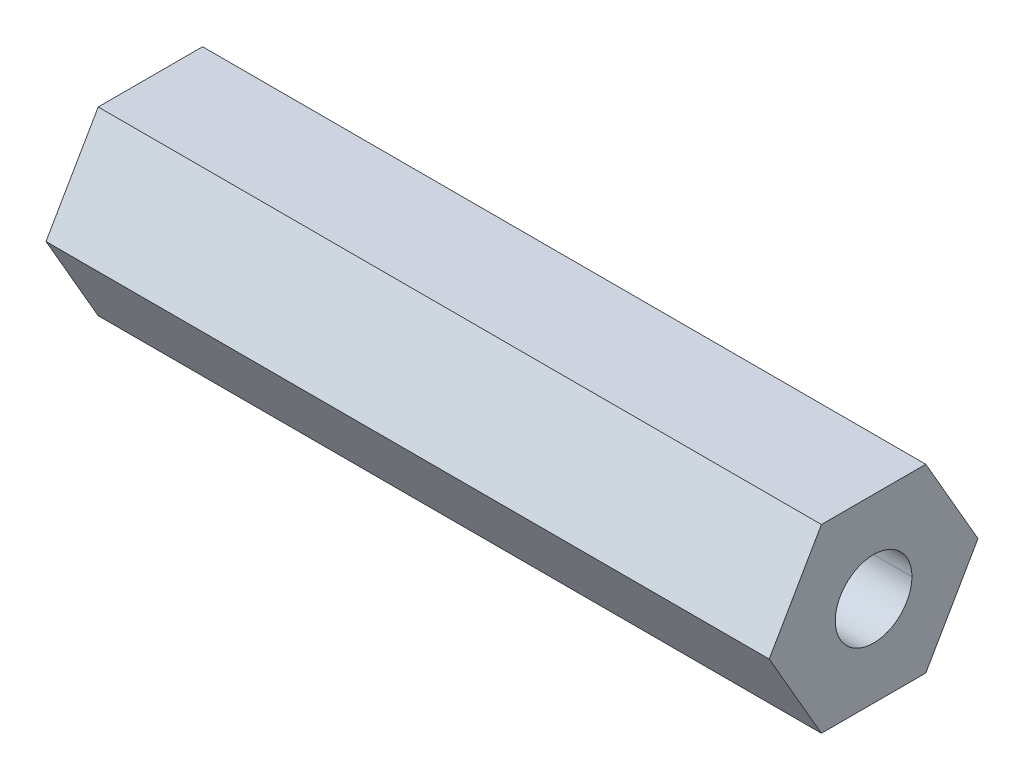
ISO-10303-21;
HEADER;
FILE_DESCRIPTION(('STEP AP214'),'2;1');
FILE_NAME('part.step','',(''),(''),'','','');
FILE_SCHEMA(('AUTOMOTIVE_DESIGN { 1 0 10303 214 1 1 1 1 }'));
ENDSEC;
DATA;
#1=APPLICATION_CONTEXT('core data for automotive mechanical design processes');
#2=APPLICATION_PROTOCOL_DEFINITION('international standard','automotive_design',2000,#1);
#3=PRODUCT_CONTEXT('',#1,'mechanical');
#4=PRODUCT('Part','Part','',(#3));
#5=PRODUCT_RELATED_PRODUCT_CATEGORY('part','',(#4));
#6=PRODUCT_DEFINITION_FORMATION('','',#4);
#7=PRODUCT_DEFINITION_CONTEXT('part definition',#1,'design');
#8=PRODUCT_DEFINITION('design','',#6,#7);
#9=PRODUCT_DEFINITION_SHAPE('','',#8);
#10=(LENGTH_UNIT() NAMED_UNIT(*) SI_UNIT(.MILLI.,.METRE.));
#11=(NAMED_UNIT(*) PLANE_ANGLE_UNIT() SI_UNIT($,.RADIAN.));
#12=(NAMED_UNIT(*) SI_UNIT($,.STERADIAN.) SOLID_ANGLE_UNIT());
#13=UNCERTAINTY_MEASURE_WITH_UNIT(LENGTH_MEASURE(1.E-05),#10,'distance_accuracy_value','');
#14=(GEOMETRIC_REPRESENTATION_CONTEXT(3) GLOBAL_UNCERTAINTY_ASSIGNED_CONTEXT((#13)) GLOBAL_UNIT_ASSIGNED_CONTEXT((#10,
#11,#12)) REPRESENTATION_CONTEXT('',''));
#15=CARTESIAN_POINT('',(0.,0.,0.));
#16=DIRECTION('',(0.,0.,1.));
#17=DIRECTION('',(1.,0.,0.));
#18=AXIS2_PLACEMENT_3D('',#15,#16,#17);
#19=CARTESIAN_POINT('',(38.1,0.,0.));
#20=DIRECTION('',(1.,0.,0.));
#21=DIRECTION('',(0.,0.,-1.));
#22=AXIS2_PLACEMENT_3D('',#19,#20,#21);
#23=CYLINDRICAL_SURFACE('',#22,2.0193);
#24=DIRECTION('',(1.,0.,0.));
#25=VECTOR('',#24,1.);
#26=CARTESIAN_POINT('',(38.1,0.,2.0193));
#27=LINE('',#26,#25);
#28=CARTESIAN_POINT('',(6.35,0.,2.0193));
#29=VERTEX_POINT('',#28);
#30=CARTESIAN_POINT('',(38.1,0.,2.0193));
#31=VERTEX_POINT('',#30);
#32=EDGE_CURVE('E160',#29,#31,#27,.T.);
#33=ORIENTED_EDGE('',*,*,#32,.F.);
#34=CARTESIAN_POINT('',(6.35,0.,0.));
#35=DIRECTION('',(1.,0.,0.));
#36=DIRECTION('',(0.,0.,-1.));
#37=AXIS2_PLACEMENT_3D('',#34,#35,#36);
#38=CIRCLE('',#37,2.0193);
#39=CARTESIAN_POINT('',(6.35,0.,-2.0193));
#40=VERTEX_POINT('',#39);
#41=EDGE_CURVE('E46',#40,#29,#38,.T.);
#42=ORIENTED_EDGE('',*,*,#41,.F.);
#43=DIRECTION('',(1.,0.,0.));
#44=VECTOR('',#43,1.);
#45=CARTESIAN_POINT('',(38.1,0.,-2.0193));
#46=LINE('',#45,#44);
#47=CARTESIAN_POINT('',(38.1,0.,-2.0193));
#48=VERTEX_POINT('',#47);
#49=EDGE_CURVE('E159',#40,#48,#46,.T.);
#50=ORIENTED_EDGE('',*,*,#49,.T.);
#51=CARTESIAN_POINT('',(38.1,0.,0.));
#52=DIRECTION('',(1.,0.,0.));
#53=DIRECTION('',(0.,0.,-1.));
#54=AXIS2_PLACEMENT_3D('',#51,#52,#53);
#55=CIRCLE('',#54,2.0193);
#56=EDGE_CURVE('E94',#48,#31,#55,.T.);
#57=ORIENTED_EDGE('',*,*,#56,.T.);
#58=EDGE_LOOP('',(#33,#42,#50,#57));
#59=FACE_BOUND('',#58,.T.);
#60=ADVANCED_FACE('F38',(#59),#23,.F.);
#61=CARTESIAN_POINT('',(6.35,0.,0.));
#62=DIRECTION('',(1.,0.,0.));
#63=DIRECTION('',(0.,0.,-1.));
#64=AXIS2_PLACEMENT_3D('',#61,#62,#63);
#65=CONICAL_SURFACE('',#64,2.0193,1.02974425867665);
#66=DIRECTION('',(0.515038074910058,0.,0.85716730070211));
#67=VECTOR('',#66,1.);
#68=CARTESIAN_POINT('',(6.35,0.,2.0193));
#69=LINE('',#68,#67);
#70=CARTESIAN_POINT('',(5.13668215199765,0.,0.));
#71=VERTEX_POINT('',#70);
#72=EDGE_CURVE('E133',#71,#29,#69,.T.);
#73=ORIENTED_EDGE('',*,*,#72,.F.);
#74=DIRECTION('',(0.515038074910058,0.,-0.85716730070211));
#75=VECTOR('',#74,1.);
#76=CARTESIAN_POINT('',(6.35,0.,-2.0193));
#77=LINE('',#76,#75);
#78=EDGE_CURVE('E140',#71,#40,#77,.T.);
#79=ORIENTED_EDGE('',*,*,#78,.T.);
#80=ORIENTED_EDGE('',*,*,#41,.T.);
#81=EDGE_LOOP('',(#73,#79,#80));
#82=FACE_BOUND('',#81,.T.);
#83=ADVANCED_FACE('F291',(#82),#65,.F.);
#84=CARTESIAN_POINT('',(38.1,0.,0.));
#85=DIRECTION('',(1.,0.,0.));
#86=DIRECTION('',(0.,1.,0.));
#87=AXIS2_PLACEMENT_3D('',#84,#85,#86);
#88=PLANE('',#87);
#89=ORIENTED_EDGE('',*,*,#56,.F.);
#90=CARTESIAN_POINT('',(38.1,0.,0.));
#91=DIRECTION('',(1.,0.,0.));
#92=DIRECTION('',(0.,0.,-1.));
#93=AXIS2_PLACEMENT_3D('',#90,#91,#92);
#94=CIRCLE('',#93,2.0193);
#95=EDGE_CURVE('E164',#31,#48,#94,.T.);
#96=ORIENTED_EDGE('',*,*,#95,.F.);
#97=EDGE_LOOP('',(#89,#96));
#98=FACE_BOUND('',#97,.T.);
#99=DIRECTION('',(0.,0.866025403784442,-0.5));
#100=VECTOR('',#99,1.);
#101=CARTESIAN_POINT('',(38.1,-4.7625,-2.74963065701564));
#102=LINE('',#101,#100);
#103=CARTESIAN_POINT('',(38.1,-4.7625,-2.74963065701564));
#104=VERTEX_POINT('',#103);
#105=CARTESIAN_POINT('',(38.1,0.,-5.49926131403117));
#106=VERTEX_POINT('',#105);
#107=EDGE_CURVE('E124',#104,#106,#102,.T.);
#108=ORIENTED_EDGE('',*,*,#107,.T.);
#109=DIRECTION('',(0.,0.866025403784438,0.5));
#110=VECTOR('',#109,1.);
#111=CARTESIAN_POINT('',(38.1,0.,-5.49926131403117));
#112=LINE('',#111,#110);
#113=CARTESIAN_POINT('',(38.1,4.7625,-2.74963065701557));
#114=VERTEX_POINT('',#113);
#115=EDGE_CURVE('E111',#106,#114,#112,.T.);
#116=ORIENTED_EDGE('',*,*,#115,.T.);
#117=DIRECTION('',(0.,0.,1.));
#118=VECTOR('',#117,1.);
#119=CARTESIAN_POINT('',(38.1,4.7625,-2.74963065701557));
#120=LINE('',#119,#118);
#121=CARTESIAN_POINT('',(38.1,4.7625,2.7496306570156));
#122=VERTEX_POINT('',#121);
#123=EDGE_CURVE('E147',#114,#122,#120,.T.);
#124=ORIENTED_EDGE('',*,*,#123,.T.);
#125=DIRECTION('',(0.,-0.866025403784442,0.5));
#126=VECTOR('',#125,1.);
#127=CARTESIAN_POINT('',(38.1,4.7625,2.7496306570156));
#128=LINE('',#127,#126);
#129=CARTESIAN_POINT('',(38.1,0.,5.49926131403117));
#130=VERTEX_POINT('',#129);
#131=EDGE_CURVE('E156',#122,#130,#128,.T.);
#132=ORIENTED_EDGE('',*,*,#131,.T.);
#133=DIRECTION('',(0.,-0.866025403784435,-0.500000000000007));
#134=VECTOR('',#133,1.);
#135=CARTESIAN_POINT('',(38.1,0.,5.49926131403117));
#136=LINE('',#135,#134);
#137=CARTESIAN_POINT('',(38.1,-4.7625,2.74963065701554));
#138=VERTEX_POINT('',#137);
#139=EDGE_CURVE('E155',#130,#138,#136,.T.);
#140=ORIENTED_EDGE('',*,*,#139,.T.);
#141=DIRECTION('',(0.,0.,-1.));
#142=VECTOR('',#141,1.);
#143=CARTESIAN_POINT('',(38.1,-4.7625,2.74963065701554));
#144=LINE('',#143,#142);
#145=EDGE_CURVE('E65',#138,#104,#144,.T.);
#146=ORIENTED_EDGE('',*,*,#145,.T.);
#147=EDGE_LOOP('',(#108,#116,#124,#132,#140,#146));
#148=FACE_BOUND('',#147,.T.);
#149=ADVANCED_FACE('F125',(#98,#148),#88,.T.);
#150=CARTESIAN_POINT('',(38.1,-4.7625,2.74963065701554));
#151=DIRECTION('',(0.,1.,0.));
#152=DIRECTION('',(0.,0.,-1.));
#153=AXIS2_PLACEMENT_3D('',#150,#151,#152);
#154=PLANE('',#153);
#155=DIRECTION('',(-1.,0.,0.));
#156=VECTOR('',#155,1.);
#157=CARTESIAN_POINT('',(38.1,-4.7625,2.74963065701554));
#158=LINE('',#157,#156);
#159=CARTESIAN_POINT('',(0.,-4.76250000000003,2.74963065701553));
#160=VERTEX_POINT('',#159);
#161=EDGE_CURVE('E152',#138,#160,#158,.T.);
#162=ORIENTED_EDGE('',*,*,#161,.T.);
#163=DIRECTION('',(0.,0.,-1.));
#164=VECTOR('',#163,1.);
#165=CARTESIAN_POINT('',(0.,-4.7625,-5.49926131403119));
#166=LINE('',#165,#164);
#167=CARTESIAN_POINT('',(0.,-4.76250000000001,-2.74963065701564));
#168=VERTEX_POINT('',#167);
#169=EDGE_CURVE('E346',#160,#168,#166,.T.);
#170=ORIENTED_EDGE('',*,*,#169,.T.);
#171=DIRECTION('',(-1.,0.,0.));
#172=VECTOR('',#171,1.);
#173=CARTESIAN_POINT('',(38.1,-4.7625,-2.74963065701564));
#174=LINE('',#173,#172);
#175=EDGE_CURVE('E129',#104,#168,#174,.T.);
#176=ORIENTED_EDGE('',*,*,#175,.F.);
#177=ORIENTED_EDGE('',*,*,#145,.F.);
#178=EDGE_LOOP('',(#162,#170,#176,#177));
#179=FACE_BOUND('',#178,.T.);
#180=ADVANCED_FACE('F222',(#179),#154,.F.);
#181=CARTESIAN_POINT('',(38.1,0.,5.49926131403117));
#182=DIRECTION('',(0.,0.500000000000007,-0.866025403784435));
#183=DIRECTION('',(-1.,0.,0.));
#184=AXIS2_PLACEMENT_3D('',#181,#182,#183);
#185=PLANE('',#184);
#186=DIRECTION('',(-1.,0.,0.));
#187=VECTOR('',#186,1.);
#188=CARTESIAN_POINT('',(38.1,0.,5.49926131403117));
#189=LINE('',#188,#187);
#190=CARTESIAN_POINT('',(0.,0.,5.49926131403117));
#191=VERTEX_POINT('',#190);
#192=EDGE_CURVE('E168',#130,#191,#189,.T.);
#193=ORIENTED_EDGE('',*,*,#192,.T.);
#194=DIRECTION('',(0.,-0.866025403784435,-0.500000000000007));
#195=VECTOR('',#194,1.);
#196=CARTESIAN_POINT('',(0.,0.,5.49926131403117));
#197=LINE('',#196,#195);
#198=EDGE_CURVE('E175',#191,#160,#197,.T.);
#199=ORIENTED_EDGE('',*,*,#198,.T.);
#200=ORIENTED_EDGE('',*,*,#161,.F.);
#201=ORIENTED_EDGE('',*,*,#139,.F.);
#202=EDGE_LOOP('',(#193,#199,#200,#201));
#203=FACE_BOUND('',#202,.T.);
#204=ADVANCED_FACE('F40',(#203),#185,.F.);
#205=CARTESIAN_POINT('',(38.1,4.7625,2.7496306570156));
#206=DIRECTION('',(0.,-0.5,-0.866025403784442));
#207=DIRECTION('',(0.,-0.866025403784442,0.5));
#208=AXIS2_PLACEMENT_3D('',#205,#206,#207);
#209=PLANE('',#208);
#210=DIRECTION('',(-1.,0.,0.));
#211=VECTOR('',#210,1.);
#212=CARTESIAN_POINT('',(38.1,4.7625,2.7496306570156));
#213=LINE('',#212,#211);
#214=CARTESIAN_POINT('',(0.,4.76249999999998,2.7496306570156));
#215=VERTEX_POINT('',#214);
#216=EDGE_CURVE('E121',#122,#215,#213,.T.);
#217=ORIENTED_EDGE('',*,*,#216,.T.);
#218=DIRECTION('',(0.,-0.866025403784439,0.499999999999999));
#219=VECTOR('',#218,1.);
#220=CARTESIAN_POINT('',(0.,4.7625,2.7496306570156));
#221=LINE('',#220,#219);
#222=EDGE_CURVE('E200',#215,#191,#221,.T.);
#223=ORIENTED_EDGE('',*,*,#222,.T.);
#224=ORIENTED_EDGE('',*,*,#192,.F.);
#225=ORIENTED_EDGE('',*,*,#131,.F.);
#226=EDGE_LOOP('',(#217,#223,#224,#225));
#227=FACE_BOUND('',#226,.T.);
#228=ADVANCED_FACE('F198',(#227),#209,.F.);
#229=CARTESIAN_POINT('',(38.1,4.7625,-2.74963065701557));
#230=DIRECTION('',(0.,-1.,0.));
#231=DIRECTION('',(0.,0.,-1.));
#232=AXIS2_PLACEMENT_3D('',#229,#230,#231);
#233=PLANE('',#232);
#234=DIRECTION('',(-1.,0.,0.));
#235=VECTOR('',#234,1.);
#236=CARTESIAN_POINT('',(38.1,4.7625,-2.74963065701557));
#237=LINE('',#236,#235);
#238=CARTESIAN_POINT('',(0.,4.7625,-2.74963065701558));
#239=VERTEX_POINT('',#238);
#240=EDGE_CURVE('E117',#114,#239,#237,.T.);
#241=ORIENTED_EDGE('',*,*,#240,.T.);
#242=DIRECTION('',(0.,0.,-1.));
#243=VECTOR('',#242,1.);
#244=CARTESIAN_POINT('',(0.,4.76250000000001,-5.49926131403115));
#245=LINE('',#244,#243);
#246=EDGE_CURVE('E343',#215,#239,#245,.T.);
#247=ORIENTED_EDGE('',*,*,#246,.F.);
#248=ORIENTED_EDGE('',*,*,#216,.F.);
#249=ORIENTED_EDGE('',*,*,#123,.F.);
#250=EDGE_LOOP('',(#241,#247,#248,#249));
#251=FACE_BOUND('',#250,.T.);
#252=ADVANCED_FACE('F239',(#251),#233,.F.);
#253=CARTESIAN_POINT('',(38.1,0.,-5.49926131403117));
#254=DIRECTION('',(0.,-0.5,0.866025403784438));
#255=DIRECTION('',(-1.,0.,0.));
#256=AXIS2_PLACEMENT_3D('',#253,#254,#255);
#257=PLANE('',#256);
#258=DIRECTION('',(-1.,0.,0.));
#259=VECTOR('',#258,1.);
#260=CARTESIAN_POINT('',(38.1,0.,-5.49926131403117));
#261=LINE('',#260,#259);
#262=CARTESIAN_POINT('',(0.,0.,-5.49926131403117));
#263=VERTEX_POINT('',#262);
#264=EDGE_CURVE('E115',#106,#263,#261,.T.);
#265=ORIENTED_EDGE('',*,*,#264,.T.);
#266=DIRECTION('',(0.,0.866025403784438,0.5));
#267=VECTOR('',#266,1.);
#268=CARTESIAN_POINT('',(0.,0.,-5.49926131403117));
#269=LINE('',#268,#267);
#270=EDGE_CURVE('E53',#263,#239,#269,.T.);
#271=ORIENTED_EDGE('',*,*,#270,.T.);
#272=ORIENTED_EDGE('',*,*,#240,.F.);
#273=ORIENTED_EDGE('',*,*,#115,.F.);
#274=EDGE_LOOP('',(#265,#271,#272,#273));
#275=FACE_BOUND('',#274,.T.);
#276=ADVANCED_FACE('F113',(#275),#257,.F.);
#277=CARTESIAN_POINT('',(38.1,-4.7625,-2.74963065701564));
#278=DIRECTION('',(0.,0.5,0.866025403784442));
#279=DIRECTION('',(1.,0.,0.));
#280=AXIS2_PLACEMENT_3D('',#277,#278,#279);
#281=PLANE('',#280);
#282=ORIENTED_EDGE('',*,*,#175,.T.);
#283=DIRECTION('',(0.,0.866025403784439,-0.499999999999999));
#284=VECTOR('',#283,1.);
#285=CARTESIAN_POINT('',(0.,-4.7625,-2.74963065701564));
#286=LINE('',#285,#284);
#287=EDGE_CURVE('E11',#168,#263,#286,.T.);
#288=ORIENTED_EDGE('',*,*,#287,.T.);
#289=ORIENTED_EDGE('',*,*,#264,.F.);
#290=ORIENTED_EDGE('',*,*,#107,.F.);
#291=EDGE_LOOP('',(#282,#288,#289,#290));
#292=FACE_BOUND('',#291,.T.);
#293=ADVANCED_FACE('F131',(#292),#281,.F.);
#294=CARTESIAN_POINT('',(6.35,0.,0.));
#295=DIRECTION('',(1.,0.,0.));
#296=DIRECTION('',(0.,0.,-1.));
#297=AXIS2_PLACEMENT_3D('',#294,#295,#296);
#298=CONICAL_SURFACE('',#297,2.0193,1.02974425867665);
#299=ORIENTED_EDGE('',*,*,#78,.F.);
#300=ORIENTED_EDGE('',*,*,#72,.T.);
#301=CARTESIAN_POINT('',(6.35,0.,0.));
#302=DIRECTION('',(1.,0.,0.));
#303=DIRECTION('',(0.,0.,-1.));
#304=AXIS2_PLACEMENT_3D('',#301,#302,#303);
#305=CIRCLE('',#304,2.0193);
#306=EDGE_CURVE('E165',#29,#40,#305,.T.);
#307=ORIENTED_EDGE('',*,*,#306,.T.);
#308=EDGE_LOOP('',(#299,#300,#307));
#309=FACE_BOUND('',#308,.T.);
#310=ADVANCED_FACE('F231',(#309),#298,.F.);
#311=CARTESIAN_POINT('',(38.1,0.,0.));
#312=DIRECTION('',(1.,0.,0.));
#313=DIRECTION('',(0.,0.,-1.));
#314=AXIS2_PLACEMENT_3D('',#311,#312,#313);
#315=CYLINDRICAL_SURFACE('',#314,2.0193);
#316=ORIENTED_EDGE('',*,*,#306,.F.);
#317=ORIENTED_EDGE('',*,*,#32,.T.);
#318=ORIENTED_EDGE('',*,*,#95,.T.);
#319=ORIENTED_EDGE('',*,*,#49,.F.);
#320=EDGE_LOOP('',(#316,#317,#318,#319));
#321=FACE_BOUND('',#320,.T.);
#322=ADVANCED_FACE('F254',(#321),#315,.F.);
#323=CARTESIAN_POINT('',(0.,-4.7625,-5.49926131403119));
#324=DIRECTION('',(1.,0.,0.));
#325=DIRECTION('',(0.,0.,-1.));
#326=AXIS2_PLACEMENT_3D('',#323,#324,#325);
#327=PLANE('',#326);
#328=ORIENTED_EDGE('',*,*,#222,.F.);
#329=ORIENTED_EDGE('',*,*,#246,.T.);
#330=ORIENTED_EDGE('',*,*,#270,.F.);
#331=ORIENTED_EDGE('',*,*,#287,.F.);
#332=ORIENTED_EDGE('',*,*,#169,.F.);
#333=ORIENTED_EDGE('',*,*,#198,.F.);
#334=EDGE_LOOP('',(#328,#329,#330,#331,#332,#333));
#335=FACE_BOUND('',#334,.T.);
#336=ADVANCED_FACE('F259',(#335),#327,.F.);
#337=CLOSED_SHELL('',(#60,#83,#149,#180,#204,#228,#252,#276,#293,#310,#322,#336));
#338=MANIFOLD_SOLID_BREP('B2',#337);
#339=ADVANCED_BREP_SHAPE_REPRESENTATION('',(#18,#338),#14);
#340=SHAPE_DEFINITION_REPRESENTATION(#9,#339);
ENDSEC;
END-ISO-10303-21;
